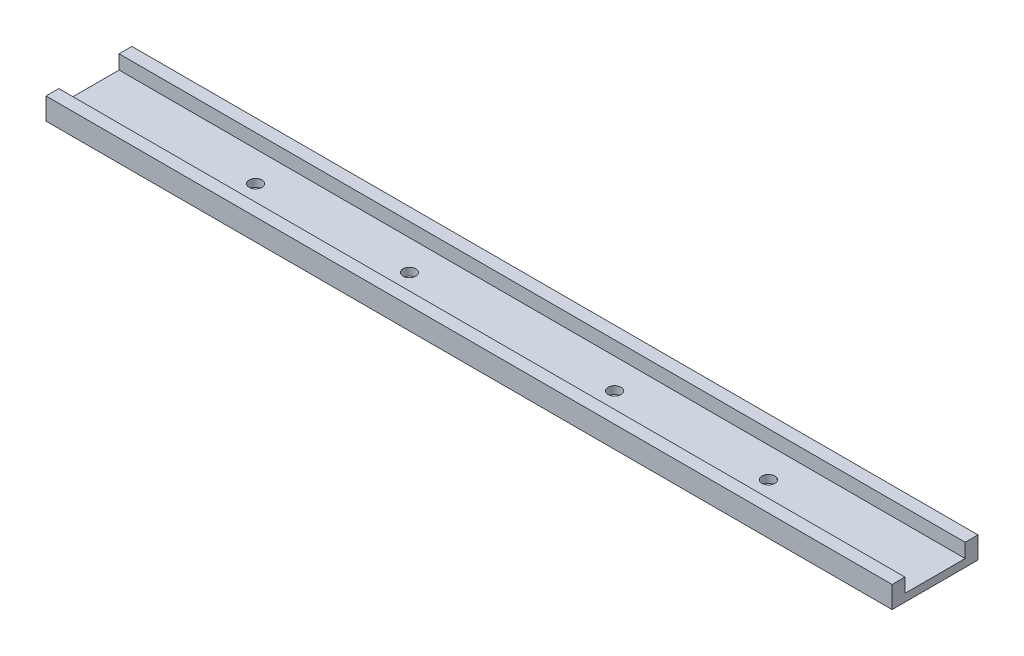
ISO-10303-21;
HEADER;
FILE_DESCRIPTION(('STEP AP214'),'2;1');
FILE_NAME('part.step','',(''),(''),'','','');
FILE_SCHEMA(('AUTOMOTIVE_DESIGN { 1 0 10303 214 1 1 1 1 }'));
ENDSEC;
DATA;
#1=APPLICATION_CONTEXT('core data for automotive mechanical design processes');
#2=APPLICATION_PROTOCOL_DEFINITION('international standard','automotive_design',2000,#1);
#3=PRODUCT_CONTEXT('',#1,'mechanical');
#4=PRODUCT('Part','Part','',(#3));
#5=PRODUCT_RELATED_PRODUCT_CATEGORY('part','',(#4));
#6=PRODUCT_DEFINITION_FORMATION('','',#4);
#7=PRODUCT_DEFINITION_CONTEXT('part definition',#1,'design');
#8=PRODUCT_DEFINITION('design','',#6,#7);
#9=PRODUCT_DEFINITION_SHAPE('','',#8);
#10=(LENGTH_UNIT() NAMED_UNIT(*) SI_UNIT(.MILLI.,.METRE.));
#11=(NAMED_UNIT(*) PLANE_ANGLE_UNIT() SI_UNIT($,.RADIAN.));
#12=(NAMED_UNIT(*) SI_UNIT($,.STERADIAN.) SOLID_ANGLE_UNIT());
#13=UNCERTAINTY_MEASURE_WITH_UNIT(LENGTH_MEASURE(1.E-05),#10,'distance_accuracy_value','');
#14=(GEOMETRIC_REPRESENTATION_CONTEXT(3) GLOBAL_UNCERTAINTY_ASSIGNED_CONTEXT((#13)) GLOBAL_UNIT_ASSIGNED_CONTEXT((#10,
#11,#12)) REPRESENTATION_CONTEXT('',''));
#15=CARTESIAN_POINT('',(0.,0.,0.));
#16=DIRECTION('',(0.,0.,1.));
#17=DIRECTION('',(1.,0.,0.));
#18=AXIS2_PLACEMENT_3D('',#15,#16,#17);
#19=CARTESIAN_POINT('',(0.,8.5,0.));
#20=DIRECTION('',(0.,1.,0.));
#21=DIRECTION('',(0.,0.,1.));
#22=AXIS2_PLACEMENT_3D('',#19,#20,#21);
#23=PLANE('',#22);
#24=DIRECTION('',(1.,0.,0.));
#25=VECTOR('',#24,1.);
#26=CARTESIAN_POINT('',(0.,8.5,5.));
#27=LINE('',#26,#25);
#28=CARTESIAN_POINT('',(0.,8.5,5.));
#29=VERTEX_POINT('',#28);
#30=CARTESIAN_POINT('',(330.,8.5,5.));
#31=VERTEX_POINT('',#30);
#32=EDGE_CURVE('E138',#29,#31,#27,.T.);
#33=ORIENTED_EDGE('',*,*,#32,.T.);
#34=DIRECTION('',(0.,0.,-1.));
#35=VECTOR('',#34,1.);
#36=CARTESIAN_POINT('',(330.,8.5,33.5));
#37=LINE('',#36,#35);
#38=CARTESIAN_POINT('',(330.,8.5,0.));
#39=VERTEX_POINT('',#38);
#40=EDGE_CURVE('E141',#31,#39,#37,.T.);
#41=ORIENTED_EDGE('',*,*,#40,.T.);
#42=DIRECTION('',(-1.,0.,0.));
#43=VECTOR('',#42,1.);
#44=CARTESIAN_POINT('',(330.,8.5,0.));
#45=LINE('',#44,#43);
#46=CARTESIAN_POINT('',(0.,8.5,0.));
#47=VERTEX_POINT('',#46);
#48=EDGE_CURVE('E157',#39,#47,#45,.T.);
#49=ORIENTED_EDGE('',*,*,#48,.T.);
#50=DIRECTION('',(0.,0.,1.));
#51=VECTOR('',#50,1.);
#52=CARTESIAN_POINT('',(0.,8.5,0.));
#53=LINE('',#52,#51);
#54=EDGE_CURVE('E160',#47,#29,#53,.T.);
#55=ORIENTED_EDGE('',*,*,#54,.T.);
#56=EDGE_LOOP('',(#33,#41,#49,#55));
#57=FACE_BOUND('',#56,.T.);
#58=ADVANCED_FACE('F32',(#57),#23,.T.);
#59=CARTESIAN_POINT('',(330.,0.,33.5));
#60=DIRECTION('',(1.,0.,0.));
#61=DIRECTION('',(0.,0.,-1.));
#62=AXIS2_PLACEMENT_3D('',#59,#60,#61);
#63=PLANE('',#62);
#64=DIRECTION('',(0.,1.,0.));
#65=VECTOR('',#64,1.);
#66=CARTESIAN_POINT('',(330.,3.,5.));
#67=LINE('',#66,#65);
#68=CARTESIAN_POINT('',(330.,3.,5.));
#69=VERTEX_POINT('',#68);
#70=EDGE_CURVE('E127',#69,#31,#67,.T.);
#71=ORIENTED_EDGE('',*,*,#70,.F.);
#72=DIRECTION('',(0.,0.,-1.));
#73=VECTOR('',#72,1.);
#74=CARTESIAN_POINT('',(330.,3.,28.5));
#75=LINE('',#74,#73);
#76=CARTESIAN_POINT('',(330.,3.,28.5));
#77=VERTEX_POINT('',#76);
#78=EDGE_CURVE('E129',#77,#69,#75,.T.);
#79=ORIENTED_EDGE('',*,*,#78,.F.);
#80=DIRECTION('',(0.,-1.,0.));
#81=VECTOR('',#80,1.);
#82=CARTESIAN_POINT('',(330.,8.5,28.5));
#83=LINE('',#82,#81);
#84=CARTESIAN_POINT('',(330.,8.5,28.5));
#85=VERTEX_POINT('',#84);
#86=EDGE_CURVE('E108',#85,#77,#83,.T.);
#87=ORIENTED_EDGE('',*,*,#86,.F.);
#88=CARTESIAN_POINT('',(330.,8.5,33.5));
#89=VERTEX_POINT('',#88);
#90=EDGE_CURVE('E154',#89,#85,#37,.T.);
#91=ORIENTED_EDGE('',*,*,#90,.F.);
#92=DIRECTION('',(0.,1.,0.));
#93=VECTOR('',#92,1.);
#94=CARTESIAN_POINT('',(330.,0.,33.5));
#95=LINE('',#94,#93);
#96=CARTESIAN_POINT('',(330.,0.,33.5));
#97=VERTEX_POINT('',#96);
#98=EDGE_CURVE('E11',#97,#89,#95,.T.);
#99=ORIENTED_EDGE('',*,*,#98,.F.);
#100=DIRECTION('',(0.,0.,-1.));
#101=VECTOR('',#100,1.);
#102=CARTESIAN_POINT('',(330.,0.,33.5));
#103=LINE('',#102,#101);
#104=CARTESIAN_POINT('',(330.,0.,0.));
#105=VERTEX_POINT('',#104);
#106=EDGE_CURVE('E144',#97,#105,#103,.T.);
#107=ORIENTED_EDGE('',*,*,#106,.T.);
#108=DIRECTION('',(0.,1.,0.));
#109=VECTOR('',#108,1.);
#110=CARTESIAN_POINT('',(330.,0.,0.));
#111=LINE('',#110,#109);
#112=EDGE_CURVE('E36',#105,#39,#111,.T.);
#113=ORIENTED_EDGE('',*,*,#112,.T.);
#114=ORIENTED_EDGE('',*,*,#40,.F.);
#115=EDGE_LOOP('',(#71,#79,#87,#91,#99,#107,#113,#114));
#116=FACE_BOUND('',#115,.T.);
#117=ADVANCED_FACE('F34',(#116),#63,.T.);
#118=CARTESIAN_POINT('',(0.,0.,33.5));
#119=DIRECTION('',(0.,0.,1.));
#120=DIRECTION('',(1.,0.,0.));
#121=AXIS2_PLACEMENT_3D('',#118,#119,#120);
#122=PLANE('',#121);
#123=DIRECTION('',(1.,0.,0.));
#124=VECTOR('',#123,1.);
#125=CARTESIAN_POINT('',(0.,8.5,33.5));
#126=LINE('',#125,#124);
#127=CARTESIAN_POINT('',(0.,8.5,33.5));
#128=VERTEX_POINT('',#127);
#129=EDGE_CURVE('E147',#128,#89,#126,.T.);
#130=ORIENTED_EDGE('',*,*,#129,.F.);
#131=DIRECTION('',(0.,1.,0.));
#132=VECTOR('',#131,1.);
#133=CARTESIAN_POINT('',(0.,0.,33.5));
#134=LINE('',#133,#132);
#135=CARTESIAN_POINT('',(0.,0.,33.5));
#136=VERTEX_POINT('',#135);
#137=EDGE_CURVE('E41',#136,#128,#134,.T.);
#138=ORIENTED_EDGE('',*,*,#137,.F.);
#139=DIRECTION('',(1.,0.,0.));
#140=VECTOR('',#139,1.);
#141=CARTESIAN_POINT('',(0.,0.,33.5));
#142=LINE('',#141,#140);
#143=EDGE_CURVE('E152',#136,#97,#142,.T.);
#144=ORIENTED_EDGE('',*,*,#143,.T.);
#145=ORIENTED_EDGE('',*,*,#98,.T.);
#146=EDGE_LOOP('',(#130,#138,#144,#145));
#147=FACE_BOUND('',#146,.T.);
#148=ADVANCED_FACE('F177',(#147),#122,.T.);
#149=CARTESIAN_POINT('',(0.,0.,0.));
#150=DIRECTION('',(-1.,0.,0.));
#151=DIRECTION('',(0.,0.,1.));
#152=AXIS2_PLACEMENT_3D('',#149,#150,#151);
#153=PLANE('',#152);
#154=DIRECTION('',(0.,1.,0.));
#155=VECTOR('',#154,1.);
#156=CARTESIAN_POINT('',(0.,3.,5.));
#157=LINE('',#156,#155);
#158=CARTESIAN_POINT('',(0.,3.,5.));
#159=VERTEX_POINT('',#158);
#160=EDGE_CURVE('E121',#159,#29,#157,.T.);
#161=ORIENTED_EDGE('',*,*,#160,.T.);
#162=ORIENTED_EDGE('',*,*,#54,.F.);
#163=DIRECTION('',(0.,1.,0.));
#164=VECTOR('',#163,1.);
#165=CARTESIAN_POINT('',(0.,0.,0.));
#166=LINE('',#165,#164);
#167=CARTESIAN_POINT('',(0.,0.,0.));
#168=VERTEX_POINT('',#167);
#169=EDGE_CURVE('E165',#168,#47,#166,.T.);
#170=ORIENTED_EDGE('',*,*,#169,.F.);
#171=DIRECTION('',(0.,0.,1.));
#172=VECTOR('',#171,1.);
#173=CARTESIAN_POINT('',(0.,0.,0.));
#174=LINE('',#173,#172);
#175=EDGE_CURVE('E149',#168,#136,#174,.T.);
#176=ORIENTED_EDGE('',*,*,#175,.T.);
#177=ORIENTED_EDGE('',*,*,#137,.T.);
#178=CARTESIAN_POINT('',(0.,8.5,28.5));
#179=VERTEX_POINT('',#178);
#180=EDGE_CURVE('E126',#179,#128,#53,.T.);
#181=ORIENTED_EDGE('',*,*,#180,.F.);
#182=DIRECTION('',(0.,-1.,0.));
#183=VECTOR('',#182,1.);
#184=CARTESIAN_POINT('',(0.,8.5,28.5));
#185=LINE('',#184,#183);
#186=CARTESIAN_POINT('',(0.,3.,28.5));
#187=VERTEX_POINT('',#186);
#188=EDGE_CURVE('E49',#179,#187,#185,.T.);
#189=ORIENTED_EDGE('',*,*,#188,.T.);
#190=DIRECTION('',(0.,0.,-1.));
#191=VECTOR('',#190,1.);
#192=CARTESIAN_POINT('',(0.,3.,28.5));
#193=LINE('',#192,#191);
#194=EDGE_CURVE('E116',#187,#159,#193,.T.);
#195=ORIENTED_EDGE('',*,*,#194,.T.);
#196=EDGE_LOOP('',(#161,#162,#170,#176,#177,#181,#189,#195));
#197=FACE_BOUND('',#196,.T.);
#198=ADVANCED_FACE('F124',(#197),#153,.T.);
#199=CARTESIAN_POINT('',(330.,0.,0.));
#200=DIRECTION('',(0.,0.,-1.));
#201=DIRECTION('',(-1.,0.,0.));
#202=AXIS2_PLACEMENT_3D('',#199,#200,#201);
#203=PLANE('',#202);
#204=ORIENTED_EDGE('',*,*,#48,.F.);
#205=ORIENTED_EDGE('',*,*,#112,.F.);
#206=DIRECTION('',(-1.,0.,0.));
#207=VECTOR('',#206,1.);
#208=CARTESIAN_POINT('',(330.,0.,0.));
#209=LINE('',#208,#207);
#210=EDGE_CURVE('E146',#105,#168,#209,.T.);
#211=ORIENTED_EDGE('',*,*,#210,.T.);
#212=ORIENTED_EDGE('',*,*,#169,.T.);
#213=EDGE_LOOP('',(#204,#205,#211,#212));
#214=FACE_BOUND('',#213,.T.);
#215=ADVANCED_FACE('F169',(#214),#203,.T.);
#216=CARTESIAN_POINT('',(0.,0.,0.));
#217=DIRECTION('',(0.,1.,0.));
#218=DIRECTION('',(0.,0.,1.));
#219=AXIS2_PLACEMENT_3D('',#216,#217,#218);
#220=PLANE('',#219);
#221=CARTESIAN_POINT('',(65.,0.,16.75));
#222=DIRECTION('',(0.,1.,0.));
#223=DIRECTION('',(0.,0.,1.));
#224=AXIS2_PLACEMENT_3D('',#221,#222,#223);
#225=CIRCLE('',#224,2.49999999999999);
#226=CARTESIAN_POINT('',(65.,0.,19.25));
#227=VERTEX_POINT('',#226);
#228=EDGE_CURVE('E275',#227,#227,#225,.T.);
#229=ORIENTED_EDGE('',*,*,#228,.T.);
#230=EDGE_LOOP('',(#229));
#231=FACE_BOUND('',#230,.T.);
#232=CARTESIAN_POINT('',(125.,0.,16.75));
#233=DIRECTION('',(0.,1.,0.));
#234=DIRECTION('',(0.,0.,1.));
#235=AXIS2_PLACEMENT_3D('',#232,#233,#234);
#236=CIRCLE('',#235,2.49999999999997);
#237=CARTESIAN_POINT('',(125.,0.,19.25));
#238=VERTEX_POINT('',#237);
#239=EDGE_CURVE('E285',#238,#238,#236,.T.);
#240=ORIENTED_EDGE('',*,*,#239,.T.);
#241=EDGE_LOOP('',(#240));
#242=FACE_BOUND('',#241,.T.);
#243=CARTESIAN_POINT('',(265.,0.,16.75));
#244=DIRECTION('',(0.,1.,0.));
#245=DIRECTION('',(0.,0.,1.));
#246=AXIS2_PLACEMENT_3D('',#243,#244,#245);
#247=CIRCLE('',#246,2.5);
#248=CARTESIAN_POINT('',(265.,0.,19.25));
#249=VERTEX_POINT('',#248);
#250=EDGE_CURVE('E291',#249,#249,#247,.T.);
#251=ORIENTED_EDGE('',*,*,#250,.T.);
#252=EDGE_LOOP('',(#251));
#253=FACE_BOUND('',#252,.T.);
#254=CARTESIAN_POINT('',(205.,0.,16.75));
#255=DIRECTION('',(0.,1.,0.));
#256=DIRECTION('',(0.,0.,1.));
#257=AXIS2_PLACEMENT_3D('',#254,#255,#256);
#258=CIRCLE('',#257,2.49999999999997);
#259=CARTESIAN_POINT('',(205.,0.,19.25));
#260=VERTEX_POINT('',#259);
#261=EDGE_CURVE('E132',#260,#260,#258,.T.);
#262=ORIENTED_EDGE('',*,*,#261,.T.);
#263=EDGE_LOOP('',(#262));
#264=FACE_BOUND('',#263,.T.);
#265=ORIENTED_EDGE('',*,*,#106,.F.);
#266=ORIENTED_EDGE('',*,*,#143,.F.);
#267=ORIENTED_EDGE('',*,*,#175,.F.);
#268=ORIENTED_EDGE('',*,*,#210,.F.);
#269=EDGE_LOOP('',(#265,#266,#267,#268));
#270=FACE_BOUND('',#269,.T.);
#271=ADVANCED_FACE('F176',(#231,#242,#253,#264,#270),#220,.F.);
#272=DIRECTION('',(1.,0.,0.));
#273=VECTOR('',#272,1.);
#274=CARTESIAN_POINT('',(0.,8.5,28.5));
#275=LINE('',#274,#273);
#276=EDGE_CURVE('E113',#179,#85,#275,.T.);
#277=ORIENTED_EDGE('',*,*,#276,.F.);
#278=ORIENTED_EDGE('',*,*,#180,.T.);
#279=ORIENTED_EDGE('',*,*,#129,.T.);
#280=ORIENTED_EDGE('',*,*,#90,.T.);
#281=EDGE_LOOP('',(#277,#278,#279,#280));
#282=FACE_BOUND('',#281,.T.);
#283=ADVANCED_FACE('F179',(#282),#23,.T.);
#284=CARTESIAN_POINT('',(0.,3.,5.));
#285=DIRECTION('',(0.,0.,-1.));
#286=DIRECTION('',(0.,1.,0.));
#287=AXIS2_PLACEMENT_3D('',#284,#285,#286);
#288=PLANE('',#287);
#289=ORIENTED_EDGE('',*,*,#70,.T.);
#290=ORIENTED_EDGE('',*,*,#32,.F.);
#291=ORIENTED_EDGE('',*,*,#160,.F.);
#292=DIRECTION('',(1.,0.,0.));
#293=VECTOR('',#292,1.);
#294=CARTESIAN_POINT('',(0.,3.,5.));
#295=LINE('',#294,#293);
#296=EDGE_CURVE('E112',#159,#69,#295,.T.);
#297=ORIENTED_EDGE('',*,*,#296,.T.);
#298=EDGE_LOOP('',(#289,#290,#291,#297));
#299=FACE_BOUND('',#298,.T.);
#300=ADVANCED_FACE('F172',(#299),#288,.F.);
#301=CARTESIAN_POINT('',(0.,3.,28.5));
#302=DIRECTION('',(0.,-1.,0.));
#303=DIRECTION('',(0.,0.,-1.));
#304=AXIS2_PLACEMENT_3D('',#301,#302,#303);
#305=PLANE('',#304);
#306=CARTESIAN_POINT('',(65.,3.,16.75));
#307=DIRECTION('',(0.,1.,0.));
#308=DIRECTION('',(0.,0.,1.));
#309=AXIS2_PLACEMENT_3D('',#306,#307,#308);
#310=CIRCLE('',#309,2.49999999999999);
#311=CARTESIAN_POINT('',(65.,3.,19.25));
#312=VERTEX_POINT('',#311);
#313=EDGE_CURVE('E278',#312,#312,#310,.T.);
#314=ORIENTED_EDGE('',*,*,#313,.F.);
#315=EDGE_LOOP('',(#314));
#316=FACE_BOUND('',#315,.T.);
#317=CARTESIAN_POINT('',(125.,3.,16.75));
#318=DIRECTION('',(0.,1.,0.));
#319=DIRECTION('',(0.,0.,1.));
#320=AXIS2_PLACEMENT_3D('',#317,#318,#319);
#321=CIRCLE('',#320,2.49999999999997);
#322=CARTESIAN_POINT('',(125.,3.,19.25));
#323=VERTEX_POINT('',#322);
#324=EDGE_CURVE('E280',#323,#323,#321,.T.);
#325=ORIENTED_EDGE('',*,*,#324,.F.);
#326=EDGE_LOOP('',(#325));
#327=FACE_BOUND('',#326,.T.);
#328=CARTESIAN_POINT('',(265.,3.,16.75));
#329=DIRECTION('',(0.,1.,0.));
#330=DIRECTION('',(0.,0.,1.));
#331=AXIS2_PLACEMENT_3D('',#328,#329,#330);
#332=CIRCLE('',#331,2.5);
#333=CARTESIAN_POINT('',(265.,3.,19.25));
#334=VERTEX_POINT('',#333);
#335=EDGE_CURVE('E288',#334,#334,#332,.T.);
#336=ORIENTED_EDGE('',*,*,#335,.F.);
#337=EDGE_LOOP('',(#336));
#338=FACE_BOUND('',#337,.T.);
#339=CARTESIAN_POINT('',(205.,3.,16.75));
#340=DIRECTION('',(0.,1.,0.));
#341=DIRECTION('',(0.,0.,1.));
#342=AXIS2_PLACEMENT_3D('',#339,#340,#341);
#343=CIRCLE('',#342,2.49999999999997);
#344=CARTESIAN_POINT('',(205.,3.,19.25));
#345=VERTEX_POINT('',#344);
#346=EDGE_CURVE('E293',#345,#345,#343,.T.);
#347=ORIENTED_EDGE('',*,*,#346,.F.);
#348=EDGE_LOOP('',(#347));
#349=FACE_BOUND('',#348,.T.);
#350=ORIENTED_EDGE('',*,*,#78,.T.);
#351=ORIENTED_EDGE('',*,*,#296,.F.);
#352=ORIENTED_EDGE('',*,*,#194,.F.);
#353=DIRECTION('',(1.,0.,0.));
#354=VECTOR('',#353,1.);
#355=CARTESIAN_POINT('',(0.,3.,28.5));
#356=LINE('',#355,#354);
#357=EDGE_CURVE('E104',#187,#77,#356,.T.);
#358=ORIENTED_EDGE('',*,*,#357,.T.);
#359=EDGE_LOOP('',(#350,#351,#352,#358));
#360=FACE_BOUND('',#359,.T.);
#361=ADVANCED_FACE('F117',(#316,#327,#338,#349,#360),#305,.F.);
#362=CARTESIAN_POINT('',(0.,8.5,28.5));
#363=DIRECTION('',(0.,0.,1.));
#364=DIRECTION('',(1.,0.,0.));
#365=AXIS2_PLACEMENT_3D('',#362,#363,#364);
#366=PLANE('',#365);
#367=ORIENTED_EDGE('',*,*,#86,.T.);
#368=ORIENTED_EDGE('',*,*,#357,.F.);
#369=ORIENTED_EDGE('',*,*,#188,.F.);
#370=ORIENTED_EDGE('',*,*,#276,.T.);
#371=EDGE_LOOP('',(#367,#368,#369,#370));
#372=FACE_BOUND('',#371,.T.);
#373=ADVANCED_FACE('F106',(#372),#366,.F.);
#374=CARTESIAN_POINT('',(205.,3.,16.75));
#375=DIRECTION('',(0.,1.,0.));
#376=DIRECTION('',(0.,0.,1.));
#377=AXIS2_PLACEMENT_3D('',#374,#375,#376);
#378=CYLINDRICAL_SURFACE('',#377,2.49999999999997);
#379=ORIENTED_EDGE('',*,*,#261,.F.);
#380=EDGE_LOOP('',(#379));
#381=FACE_BOUND('',#380,.T.);
#382=ORIENTED_EDGE('',*,*,#346,.T.);
#383=EDGE_LOOP('',(#382));
#384=FACE_BOUND('',#383,.T.);
#385=ADVANCED_FACE('F231',(#381,#384),#378,.F.);
#386=CARTESIAN_POINT('',(265.,3.,16.75));
#387=DIRECTION('',(0.,1.,0.));
#388=DIRECTION('',(0.,0.,1.));
#389=AXIS2_PLACEMENT_3D('',#386,#387,#388);
#390=CYLINDRICAL_SURFACE('',#389,2.5);
#391=ORIENTED_EDGE('',*,*,#250,.F.);
#392=EDGE_LOOP('',(#391));
#393=FACE_BOUND('',#392,.T.);
#394=ORIENTED_EDGE('',*,*,#335,.T.);
#395=EDGE_LOOP('',(#394));
#396=FACE_BOUND('',#395,.T.);
#397=ADVANCED_FACE('F236',(#393,#396),#390,.F.);
#398=CARTESIAN_POINT('',(125.,3.,16.75));
#399=DIRECTION('',(0.,1.,0.));
#400=DIRECTION('',(0.,0.,1.));
#401=AXIS2_PLACEMENT_3D('',#398,#399,#400);
#402=CYLINDRICAL_SURFACE('',#401,2.49999999999997);
#403=ORIENTED_EDGE('',*,*,#239,.F.);
#404=EDGE_LOOP('',(#403));
#405=FACE_BOUND('',#404,.T.);
#406=ORIENTED_EDGE('',*,*,#324,.T.);
#407=EDGE_LOOP('',(#406));
#408=FACE_BOUND('',#407,.T.);
#409=ADVANCED_FACE('F246',(#405,#408),#402,.F.);
#410=CARTESIAN_POINT('',(65.,3.,16.75));
#411=DIRECTION('',(0.,1.,0.));
#412=DIRECTION('',(0.,0.,1.));
#413=AXIS2_PLACEMENT_3D('',#410,#411,#412);
#414=CYLINDRICAL_SURFACE('',#413,2.49999999999999);
#415=ORIENTED_EDGE('',*,*,#228,.F.);
#416=EDGE_LOOP('',(#415));
#417=FACE_BOUND('',#416,.T.);
#418=ORIENTED_EDGE('',*,*,#313,.T.);
#419=EDGE_LOOP('',(#418));
#420=FACE_BOUND('',#419,.T.);
#421=ADVANCED_FACE('F256',(#417,#420),#414,.F.);
#422=CLOSED_SHELL('',(#58,#117,#148,#198,#215,#271,#283,#300,#361,#373,#385,#397,#409,#421));
#423=MANIFOLD_SOLID_BREP('B2',#422);
#424=ADVANCED_BREP_SHAPE_REPRESENTATION('',(#18,#423),#14);
#425=SHAPE_DEFINITION_REPRESENTATION(#9,#424);
ENDSEC;
END-ISO-10303-21;
